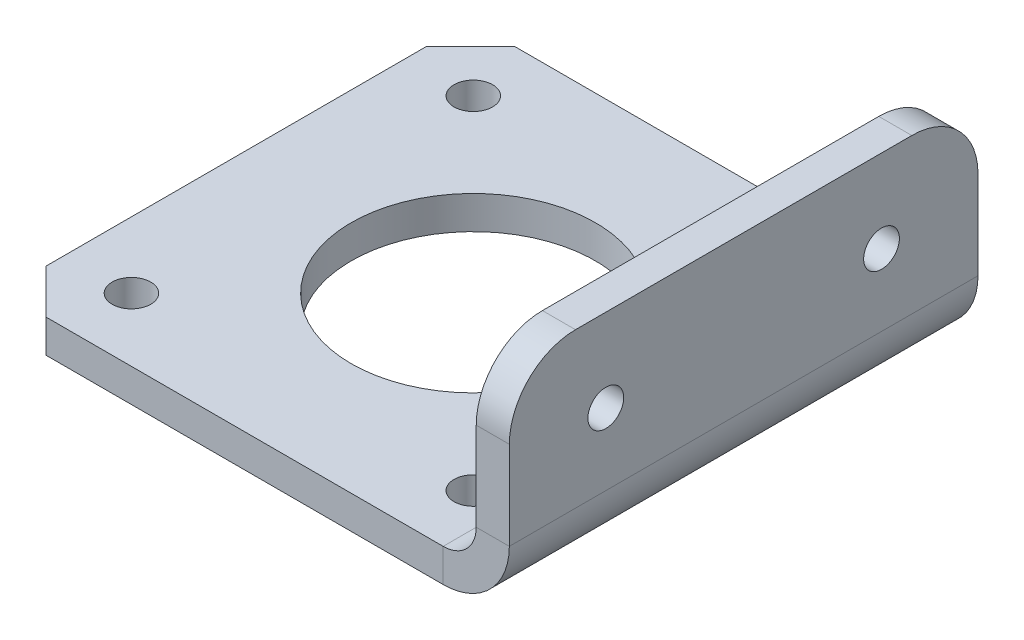
ISO-10303-21;
HEADER;
FILE_DESCRIPTION(('STEP AP214'),'2;1');
FILE_NAME('part.step','',(''),(''),'','','');
FILE_SCHEMA(('AUTOMOTIVE_DESIGN { 1 0 10303 214 1 1 1 1 }'));
ENDSEC;
DATA;
#1=APPLICATION_CONTEXT('core data for automotive mechanical design processes');
#2=APPLICATION_PROTOCOL_DEFINITION('international standard','automotive_design',2000,#1);
#3=PRODUCT_CONTEXT('',#1,'mechanical');
#4=PRODUCT('Part','Part','',(#3));
#5=PRODUCT_RELATED_PRODUCT_CATEGORY('part','',(#4));
#6=PRODUCT_DEFINITION_FORMATION('','',#4);
#7=PRODUCT_DEFINITION_CONTEXT('part definition',#1,'design');
#8=PRODUCT_DEFINITION('design','',#6,#7);
#9=PRODUCT_DEFINITION_SHAPE('','',#8);
#10=(LENGTH_UNIT() NAMED_UNIT(*) SI_UNIT(.MILLI.,.METRE.));
#11=(NAMED_UNIT(*) PLANE_ANGLE_UNIT() SI_UNIT($,.RADIAN.));
#12=(NAMED_UNIT(*) SI_UNIT($,.STERADIAN.) SOLID_ANGLE_UNIT());
#13=UNCERTAINTY_MEASURE_WITH_UNIT(LENGTH_MEASURE(1.E-05),#10,'distance_accuracy_value','');
#14=(GEOMETRIC_REPRESENTATION_CONTEXT(3) GLOBAL_UNCERTAINTY_ASSIGNED_CONTEXT((#13)) GLOBAL_UNIT_ASSIGNED_CONTEXT((#10,
#11,#12)) REPRESENTATION_CONTEXT('',''));
#15=CARTESIAN_POINT('',(0.,0.,0.));
#16=DIRECTION('',(0.,0.,1.));
#17=DIRECTION('',(1.,0.,0.));
#18=AXIS2_PLACEMENT_3D('',#15,#16,#17);
#19=CARTESIAN_POINT('',(1.51570826471148,11.0157082647115,-21.25));
#20=DIRECTION('',(0.,0.,-1.));
#21=DIRECTION('',(0.,-1.,0.));
#22=AXIS2_PLACEMENT_3D('',#19,#20,#21);
#23=PLANE('',#22);
#24=DIRECTION('',(0.,-1.,0.));
#25=VECTOR('',#24,1.);
#26=CARTESIAN_POINT('',(1.51570826471148,11.0157082647115,-21.25));
#27=LINE('',#26,#25);
#28=CARTESIAN_POINT('',(1.51570826471148,11.0157082647115,-21.25));
#29=VERTEX_POINT('',#28);
#30=CARTESIAN_POINT('',(1.51570826471148,3.,-21.25));
#31=VERTEX_POINT('',#30);
#32=EDGE_CURVE('E165',#29,#31,#27,.T.);
#33=ORIENTED_EDGE('',*,*,#32,.T.);
#34=DIRECTION('',(-1.,0.,0.));
#35=VECTOR('',#34,1.);
#36=CARTESIAN_POINT('',(1.51570826471148,3.,-21.25));
#37=LINE('',#36,#35);
#38=CARTESIAN_POINT('',(-1.48429173528852,3.,-21.25));
#39=VERTEX_POINT('',#38);
#40=EDGE_CURVE('E149',#31,#39,#37,.T.);
#41=ORIENTED_EDGE('',*,*,#40,.T.);
#42=DIRECTION('',(0.,-1.,0.));
#43=VECTOR('',#42,1.);
#44=CARTESIAN_POINT('',(-1.48429173528852,11.0157082647115,-21.25));
#45=LINE('',#44,#43);
#46=CARTESIAN_POINT('',(-1.48429173528852,11.0157082647115,-21.25));
#47=VERTEX_POINT('',#46);
#48=EDGE_CURVE('E46',#47,#39,#45,.T.);
#49=ORIENTED_EDGE('',*,*,#48,.F.);
#50=DIRECTION('',(-1.,0.,0.));
#51=VECTOR('',#50,1.);
#52=CARTESIAN_POINT('',(1.51570826471148,11.0157082647115,-21.25));
#53=LINE('',#52,#51);
#54=EDGE_CURVE('E68',#29,#47,#53,.T.);
#55=ORIENTED_EDGE('',*,*,#54,.F.);
#56=EDGE_LOOP('',(#33,#41,#49,#55));
#57=FACE_BOUND('',#56,.T.);
#58=ADVANCED_FACE('F42',(#57),#23,.T.);
#59=CARTESIAN_POINT('',(1.51570826471148,-40.0842917352885,21.25));
#60=DIRECTION('',(0.,0.,1.));
#61=DIRECTION('',(0.,1.,0.));
#62=AXIS2_PLACEMENT_3D('',#59,#60,#61);
#63=PLANE('',#62);
#64=DIRECTION('',(0.,1.,0.));
#65=VECTOR('',#64,1.);
#66=CARTESIAN_POINT('',(-1.48429173528852,-40.0842917352885,21.25));
#67=LINE('',#66,#65);
#68=CARTESIAN_POINT('',(-1.48429173528851,3.,21.25));
#69=VERTEX_POINT('',#68);
#70=CARTESIAN_POINT('',(-1.48429173528851,11.0157082647115,21.25));
#71=VERTEX_POINT('',#70);
#72=EDGE_CURVE('E176',#69,#71,#67,.T.);
#73=ORIENTED_EDGE('',*,*,#72,.F.);
#74=DIRECTION('',(1.,0.,0.));
#75=VECTOR('',#74,1.);
#76=CARTESIAN_POINT('',(1.51570826471149,3.,21.25));
#77=LINE('',#76,#75);
#78=CARTESIAN_POINT('',(1.51570826471148,3.,21.25));
#79=VERTEX_POINT('',#78);
#80=EDGE_CURVE('E12',#69,#79,#77,.T.);
#81=ORIENTED_EDGE('',*,*,#80,.T.);
#82=DIRECTION('',(0.,1.,0.));
#83=VECTOR('',#82,1.);
#84=CARTESIAN_POINT('',(1.51570826471148,-40.0842917352885,21.25));
#85=LINE('',#84,#83);
#86=CARTESIAN_POINT('',(1.51570826471149,11.0157082647115,21.25));
#87=VERTEX_POINT('',#86);
#88=EDGE_CURVE('E94',#79,#87,#85,.T.);
#89=ORIENTED_EDGE('',*,*,#88,.T.);
#90=DIRECTION('',(-1.,0.,0.));
#91=VECTOR('',#90,1.);
#92=CARTESIAN_POINT('',(1.51570826471149,11.0157082647115,21.25));
#93=LINE('',#92,#91);
#94=EDGE_CURVE('E174',#87,#71,#93,.T.);
#95=ORIENTED_EDGE('',*,*,#94,.T.);
#96=EDGE_LOOP('',(#73,#81,#89,#95));
#97=FACE_BOUND('',#96,.T.);
#98=ADVANCED_FACE('F44',(#97),#63,.T.);
#99=CARTESIAN_POINT('',(-1.48429173528851,11.0157082647115,15.25));
#100=DIRECTION('',(-1.,0.,0.));
#101=DIRECTION('',(0.,0.,1.));
#102=AXIS2_PLACEMENT_3D('',#99,#100,#101);
#103=PLANE('',#102);
#104=CARTESIAN_POINT('',(-1.48429173528852,9.49979283786554,-12.5));
#105=DIRECTION('',(1.,0.,0.));
#106=DIRECTION('',(0.,0.,-1.));
#107=AXIS2_PLACEMENT_3D('',#104,#105,#106);
#108=CIRCLE('',#107,1.62099999999999);
#109=CARTESIAN_POINT('',(-1.48429173528852,9.49979283786554,-14.121));
#110=VERTEX_POINT('',#109);
#111=EDGE_CURVE('E178',#110,#110,#108,.T.);
#112=ORIENTED_EDGE('',*,*,#111,.T.);
#113=EDGE_LOOP('',(#112));
#114=FACE_BOUND('',#113,.T.);
#115=CARTESIAN_POINT('',(-1.48429173528852,9.49979283786554,12.5));
#116=DIRECTION('',(1.,0.,0.));
#117=DIRECTION('',(0.,0.,-1.));
#118=AXIS2_PLACEMENT_3D('',#115,#116,#117);
#119=CIRCLE('',#118,1.62099999999999);
#120=CARTESIAN_POINT('',(-1.48429173528852,9.49979283786554,10.879));
#121=VERTEX_POINT('',#120);
#122=EDGE_CURVE('E188',#121,#121,#119,.T.);
#123=ORIENTED_EDGE('',*,*,#122,.T.);
#124=EDGE_LOOP('',(#123));
#125=FACE_BOUND('',#124,.T.);
#126=ORIENTED_EDGE('',*,*,#48,.T.);
#127=DIRECTION('',(0.,0.,1.));
#128=VECTOR('',#127,1.);
#129=CARTESIAN_POINT('',(-1.48429173528851,3.,15.25));
#130=LINE('',#129,#128);
#131=EDGE_CURVE('E142',#39,#69,#130,.T.);
#132=ORIENTED_EDGE('',*,*,#131,.T.);
#133=ORIENTED_EDGE('',*,*,#72,.T.);
#134=CARTESIAN_POINT('',(-1.48429173528851,11.0157082647115,15.25));
#135=DIRECTION('',(-1.,0.,0.));
#136=DIRECTION('',(0.,0.,1.));
#137=AXIS2_PLACEMENT_3D('',#134,#135,#136);
#138=CIRCLE('',#137,6.);
#139=CARTESIAN_POINT('',(-1.48429173528851,17.0157082647115,15.25));
#140=VERTEX_POINT('',#139);
#141=EDGE_CURVE('E177',#71,#140,#138,.T.);
#142=ORIENTED_EDGE('',*,*,#141,.T.);
#143=DIRECTION('',(0.,0.,-1.));
#144=VECTOR('',#143,1.);
#145=CARTESIAN_POINT('',(-1.48429173528851,17.0157082647115,15.25));
#146=LINE('',#145,#144);
#147=CARTESIAN_POINT('',(-1.48429173528852,17.0157082647115,-15.25));
#148=VERTEX_POINT('',#147);
#149=EDGE_CURVE('E180',#140,#148,#146,.T.);
#150=ORIENTED_EDGE('',*,*,#149,.T.);
#151=CARTESIAN_POINT('',(-1.48429173528852,11.0157082647115,-15.25));
#152=DIRECTION('',(-1.,0.,0.));
#153=DIRECTION('',(0.,0.,1.));
#154=AXIS2_PLACEMENT_3D('',#151,#152,#153);
#155=CIRCLE('',#154,6.);
#156=EDGE_CURVE('E164',#148,#47,#155,.T.);
#157=ORIENTED_EDGE('',*,*,#156,.T.);
#158=EDGE_LOOP('',(#126,#132,#133,#142,#150,#157));
#159=FACE_BOUND('',#158,.T.);
#160=ADVANCED_FACE('F162',(#114,#125,#159),#103,.T.);
#161=CARTESIAN_POINT('',(1.51570826471148,11.0157082647115,-15.25));
#162=DIRECTION('',(-1.,0.,0.));
#163=DIRECTION('',(0.,0.,1.));
#164=AXIS2_PLACEMENT_3D('',#161,#162,#163);
#165=CYLINDRICAL_SURFACE('',#164,6.);
#166=ORIENTED_EDGE('',*,*,#156,.F.);
#167=DIRECTION('',(-1.,0.,0.));
#168=VECTOR('',#167,1.);
#169=CARTESIAN_POINT('',(1.51570826471148,17.0157082647115,-15.25));
#170=LINE('',#169,#168);
#171=CARTESIAN_POINT('',(1.51570826471148,17.0157082647115,-15.25));
#172=VERTEX_POINT('',#171);
#173=EDGE_CURVE('E202',#172,#148,#170,.T.);
#174=ORIENTED_EDGE('',*,*,#173,.F.);
#175=CARTESIAN_POINT('',(1.51570826471148,11.0157082647115,-15.25));
#176=DIRECTION('',(-1.,0.,0.));
#177=DIRECTION('',(0.,0.,1.));
#178=AXIS2_PLACEMENT_3D('',#175,#176,#177);
#179=CIRCLE('',#178,6.);
#180=EDGE_CURVE('E175',#172,#29,#179,.T.);
#181=ORIENTED_EDGE('',*,*,#180,.T.);
#182=ORIENTED_EDGE('',*,*,#54,.T.);
#183=EDGE_LOOP('',(#166,#174,#181,#182));
#184=FACE_BOUND('',#183,.T.);
#185=ADVANCED_FACE('F214',(#184),#165,.T.);
#186=CARTESIAN_POINT('',(1.51570826471149,17.0157082647115,15.25));
#187=DIRECTION('',(0.,1.,0.));
#188=DIRECTION('',(0.,0.,-1.));
#189=AXIS2_PLACEMENT_3D('',#186,#187,#188);
#190=PLANE('',#189);
#191=ORIENTED_EDGE('',*,*,#149,.F.);
#192=DIRECTION('',(-1.,0.,0.));
#193=VECTOR('',#192,1.);
#194=CARTESIAN_POINT('',(1.51570826471149,17.0157082647115,15.25));
#195=LINE('',#194,#193);
#196=CARTESIAN_POINT('',(1.51570826471149,17.0157082647115,15.25));
#197=VERTEX_POINT('',#196);
#198=EDGE_CURVE('E204',#197,#140,#195,.T.);
#199=ORIENTED_EDGE('',*,*,#198,.F.);
#200=DIRECTION('',(0.,0.,-1.));
#201=VECTOR('',#200,1.);
#202=CARTESIAN_POINT('',(1.51570826471149,17.0157082647115,15.25));
#203=LINE('',#202,#201);
#204=EDGE_CURVE('E194',#197,#172,#203,.T.);
#205=ORIENTED_EDGE('',*,*,#204,.T.);
#206=ORIENTED_EDGE('',*,*,#173,.T.);
#207=EDGE_LOOP('',(#191,#199,#205,#206));
#208=FACE_BOUND('',#207,.T.);
#209=ADVANCED_FACE('F211',(#208),#190,.T.);
#210=CARTESIAN_POINT('',(1.51570826471148,11.0157082647115,15.25));
#211=DIRECTION('',(-1.,0.,0.));
#212=DIRECTION('',(0.,0.,1.));
#213=AXIS2_PLACEMENT_3D('',#210,#211,#212);
#214=CYLINDRICAL_SURFACE('',#213,6.);
#215=ORIENTED_EDGE('',*,*,#141,.F.);
#216=ORIENTED_EDGE('',*,*,#94,.F.);
#217=CARTESIAN_POINT('',(1.51570826471148,11.0157082647115,15.25));
#218=DIRECTION('',(-1.,0.,0.));
#219=DIRECTION('',(0.,0.,1.));
#220=AXIS2_PLACEMENT_3D('',#217,#218,#219);
#221=CIRCLE('',#220,6.);
#222=EDGE_CURVE('E173',#87,#197,#221,.T.);
#223=ORIENTED_EDGE('',*,*,#222,.T.);
#224=ORIENTED_EDGE('',*,*,#198,.T.);
#225=EDGE_LOOP('',(#215,#216,#223,#224));
#226=FACE_BOUND('',#225,.T.);
#227=ADVANCED_FACE('F208',(#226),#214,.T.);
#228=CARTESIAN_POINT('',(1.51570826471148,11.0157082647115,15.25));
#229=DIRECTION('',(-1.,0.,0.));
#230=DIRECTION('',(0.,0.,1.));
#231=AXIS2_PLACEMENT_3D('',#228,#229,#230);
#232=PLANE('',#231);
#233=DIRECTION('',(0.,0.,1.));
#234=VECTOR('',#233,1.);
#235=CARTESIAN_POINT('',(1.51570826471148,3.,15.25));
#236=LINE('',#235,#234);
#237=EDGE_CURVE('E51',#31,#79,#236,.T.);
#238=ORIENTED_EDGE('',*,*,#237,.F.);
#239=ORIENTED_EDGE('',*,*,#32,.F.);
#240=ORIENTED_EDGE('',*,*,#180,.F.);
#241=ORIENTED_EDGE('',*,*,#204,.F.);
#242=ORIENTED_EDGE('',*,*,#222,.F.);
#243=ORIENTED_EDGE('',*,*,#88,.F.);
#244=EDGE_LOOP('',(#238,#239,#240,#241,#242,#243));
#245=FACE_BOUND('',#244,.T.);
#246=CARTESIAN_POINT('',(1.51570826471149,9.49979283786554,12.5));
#247=DIRECTION('',(1.,0.,0.));
#248=DIRECTION('',(0.,0.,-1.));
#249=AXIS2_PLACEMENT_3D('',#246,#247,#248);
#250=CIRCLE('',#249,1.62099999999999);
#251=CARTESIAN_POINT('',(1.51570826471149,9.49979283786554,10.879));
#252=VERTEX_POINT('',#251);
#253=EDGE_CURVE('E244',#252,#252,#250,.T.);
#254=ORIENTED_EDGE('',*,*,#253,.F.);
#255=EDGE_LOOP('',(#254));
#256=FACE_BOUND('',#255,.T.);
#257=CARTESIAN_POINT('',(1.51570826471148,9.49979283786554,-12.5));
#258=DIRECTION('',(1.,0.,0.));
#259=DIRECTION('',(0.,0.,-1.));
#260=AXIS2_PLACEMENT_3D('',#257,#258,#259);
#261=CIRCLE('',#260,1.62099999999999);
#262=CARTESIAN_POINT('',(1.51570826471148,9.49979283786554,-14.121));
#263=VERTEX_POINT('',#262);
#264=EDGE_CURVE('E183',#263,#263,#261,.T.);
#265=ORIENTED_EDGE('',*,*,#264,.F.);
#266=EDGE_LOOP('',(#265));
#267=FACE_BOUND('',#266,.T.);
#268=ADVANCED_FACE('F230',(#245,#256,#267),#232,.F.);
#269=CARTESIAN_POINT('',(1.51570826471148,9.49979283786554,-12.5));
#270=DIRECTION('',(1.,0.,0.));
#271=DIRECTION('',(0.,0.,-1.));
#272=AXIS2_PLACEMENT_3D('',#269,#270,#271);
#273=CYLINDRICAL_SURFACE('',#272,1.62099999999999);
#274=ORIENTED_EDGE('',*,*,#111,.F.);
#275=EDGE_LOOP('',(#274));
#276=FACE_BOUND('',#275,.T.);
#277=ORIENTED_EDGE('',*,*,#264,.T.);
#278=EDGE_LOOP('',(#277));
#279=FACE_BOUND('',#278,.T.);
#280=ADVANCED_FACE('F232',(#276,#279),#273,.F.);
#281=CARTESIAN_POINT('',(1.51570826471148,9.49979283786554,12.5));
#282=DIRECTION('',(1.,0.,0.));
#283=DIRECTION('',(0.,0.,-1.));
#284=AXIS2_PLACEMENT_3D('',#281,#282,#283);
#285=CYLINDRICAL_SURFACE('',#284,1.62099999999999);
#286=ORIENTED_EDGE('',*,*,#122,.F.);
#287=EDGE_LOOP('',(#286));
#288=FACE_BOUND('',#287,.T.);
#289=ORIENTED_EDGE('',*,*,#253,.T.);
#290=EDGE_LOOP('',(#289));
#291=FACE_BOUND('',#290,.T.);
#292=ADVANCED_FACE('F238',(#288,#291),#285,.F.);
#293=CARTESIAN_POINT('',(-7.5,0.,-15.5));
#294=DIRECTION('',(0.,1.,0.));
#295=DIRECTION('',(0.,0.,1.));
#296=AXIS2_PLACEMENT_3D('',#293,#294,#295);
#297=CYLINDRICAL_SURFACE('',#296,1.74999999999999);
#298=CARTESIAN_POINT('',(-7.5,-3.,-15.5));
#299=DIRECTION('',(0.,1.,0.));
#300=DIRECTION('',(0.,0.,1.));
#301=AXIS2_PLACEMENT_3D('',#298,#299,#300);
#302=CIRCLE('',#301,1.74999999999999);
#303=CARTESIAN_POINT('',(-7.5,-3.,-13.75));
#304=VERTEX_POINT('',#303);
#305=EDGE_CURVE('E311',#304,#304,#302,.T.);
#306=ORIENTED_EDGE('',*,*,#305,.F.);
#307=EDGE_LOOP('',(#306));
#308=FACE_BOUND('',#307,.T.);
#309=CARTESIAN_POINT('',(-7.5,0.,-15.5));
#310=DIRECTION('',(0.,1.,0.));
#311=DIRECTION('',(0.,0.,1.));
#312=AXIS2_PLACEMENT_3D('',#309,#310,#311);
#313=CIRCLE('',#312,1.74999999999999);
#314=CARTESIAN_POINT('',(-7.5,0.,-13.75));
#315=VERTEX_POINT('',#314);
#316=EDGE_CURVE('E260',#315,#315,#313,.T.);
#317=ORIENTED_EDGE('',*,*,#316,.T.);
#318=EDGE_LOOP('',(#317));
#319=FACE_BOUND('',#318,.T.);
#320=ADVANCED_FACE('F375',(#308,#319),#297,.F.);
#321=CARTESIAN_POINT('',(-38.5,0.,-15.5));
#322=DIRECTION('',(0.,1.,0.));
#323=DIRECTION('',(0.,0.,1.));
#324=AXIS2_PLACEMENT_3D('',#321,#322,#323);
#325=CYLINDRICAL_SURFACE('',#324,1.74999999999999);
#326=CARTESIAN_POINT('',(-38.5,-3.,-15.5));
#327=DIRECTION('',(0.,1.,0.));
#328=DIRECTION('',(0.,0.,1.));
#329=AXIS2_PLACEMENT_3D('',#326,#327,#328);
#330=CIRCLE('',#329,1.74999999999999);
#331=CARTESIAN_POINT('',(-38.5,-3.,-13.75));
#332=VERTEX_POINT('',#331);
#333=EDGE_CURVE('E314',#332,#332,#330,.T.);
#334=ORIENTED_EDGE('',*,*,#333,.F.);
#335=EDGE_LOOP('',(#334));
#336=FACE_BOUND('',#335,.T.);
#337=CARTESIAN_POINT('',(-38.5,0.,-15.5));
#338=DIRECTION('',(0.,1.,0.));
#339=DIRECTION('',(0.,0.,1.));
#340=AXIS2_PLACEMENT_3D('',#337,#338,#339);
#341=CIRCLE('',#340,1.74999999999999);
#342=CARTESIAN_POINT('',(-38.5,0.,-13.75));
#343=VERTEX_POINT('',#342);
#344=EDGE_CURVE('E263',#343,#343,#341,.T.);
#345=ORIENTED_EDGE('',*,*,#344,.T.);
#346=EDGE_LOOP('',(#345));
#347=FACE_BOUND('',#346,.T.);
#348=ADVANCED_FACE('F380',(#336,#347),#325,.F.);
#349=CARTESIAN_POINT('',(-38.5,0.,15.5));
#350=DIRECTION('',(0.,1.,0.));
#351=DIRECTION('',(0.,0.,1.));
#352=AXIS2_PLACEMENT_3D('',#349,#350,#351);
#353=CYLINDRICAL_SURFACE('',#352,1.74999999999999);
#354=CARTESIAN_POINT('',(-38.5,-3.,15.5));
#355=DIRECTION('',(0.,1.,0.));
#356=DIRECTION('',(0.,0.,1.));
#357=AXIS2_PLACEMENT_3D('',#354,#355,#356);
#358=CIRCLE('',#357,1.74999999999999);
#359=CARTESIAN_POINT('',(-38.5,-3.,17.25));
#360=VERTEX_POINT('',#359);
#361=EDGE_CURVE('E317',#360,#360,#358,.T.);
#362=ORIENTED_EDGE('',*,*,#361,.F.);
#363=EDGE_LOOP('',(#362));
#364=FACE_BOUND('',#363,.T.);
#365=CARTESIAN_POINT('',(-38.5,0.,15.5));
#366=DIRECTION('',(0.,1.,0.));
#367=DIRECTION('',(0.,0.,1.));
#368=AXIS2_PLACEMENT_3D('',#365,#366,#367);
#369=CIRCLE('',#368,1.74999999999999);
#370=CARTESIAN_POINT('',(-38.5,0.,17.25));
#371=VERTEX_POINT('',#370);
#372=EDGE_CURVE('E266',#371,#371,#369,.T.);
#373=ORIENTED_EDGE('',*,*,#372,.T.);
#374=EDGE_LOOP('',(#373));
#375=FACE_BOUND('',#374,.T.);
#376=ADVANCED_FACE('F388',(#364,#375),#353,.F.);
#377=CARTESIAN_POINT('',(-7.5,0.,15.5));
#378=DIRECTION('',(0.,1.,0.));
#379=DIRECTION('',(0.,0.,1.));
#380=AXIS2_PLACEMENT_3D('',#377,#378,#379);
#381=CYLINDRICAL_SURFACE('',#380,1.74999999999999);
#382=CARTESIAN_POINT('',(-7.5,-3.,15.5));
#383=DIRECTION('',(0.,1.,0.));
#384=DIRECTION('',(0.,0.,1.));
#385=AXIS2_PLACEMENT_3D('',#382,#383,#384);
#386=CIRCLE('',#385,1.74999999999999);
#387=CARTESIAN_POINT('',(-7.5,-3.,17.25));
#388=VERTEX_POINT('',#387);
#389=EDGE_CURVE('E320',#388,#388,#386,.T.);
#390=ORIENTED_EDGE('',*,*,#389,.F.);
#391=EDGE_LOOP('',(#390));
#392=FACE_BOUND('',#391,.T.);
#393=CARTESIAN_POINT('',(-7.5,0.,15.5));
#394=DIRECTION('',(0.,1.,0.));
#395=DIRECTION('',(0.,0.,1.));
#396=AXIS2_PLACEMENT_3D('',#393,#394,#395);
#397=CIRCLE('',#396,1.74999999999999);
#398=CARTESIAN_POINT('',(-7.5,0.,17.25));
#399=VERTEX_POINT('',#398);
#400=EDGE_CURVE('E269',#399,#399,#397,.T.);
#401=ORIENTED_EDGE('',*,*,#400,.T.);
#402=EDGE_LOOP('',(#401));
#403=FACE_BOUND('',#402,.T.);
#404=ADVANCED_FACE('F398',(#392,#403),#381,.F.);
#405=CARTESIAN_POINT('',(-23.,0.,0.));
#406=DIRECTION('',(0.,-1.,0.));
#407=DIRECTION('',(0.,0.,-1.));
#408=AXIS2_PLACEMENT_3D('',#405,#406,#407);
#409=CYLINDRICAL_SURFACE('',#408,11.075);
#410=CARTESIAN_POINT('',(-23.,0.,0.));
#411=DIRECTION('',(0.,-1.,0.));
#412=DIRECTION('',(0.,0.,1.));
#413=AXIS2_PLACEMENT_3D('',#410,#411,#412);
#414=CIRCLE('',#413,11.075);
#415=CARTESIAN_POINT('',(-23.,0.,11.075));
#416=VERTEX_POINT('',#415);
#417=EDGE_CURVE('E303',#416,#416,#414,.T.);
#418=ORIENTED_EDGE('',*,*,#417,.F.);
#419=EDGE_LOOP('',(#418));
#420=FACE_BOUND('',#419,.T.);
#421=CARTESIAN_POINT('',(-23.,-3.,0.));
#422=DIRECTION('',(0.,-1.,0.));
#423=DIRECTION('',(0.,0.,1.));
#424=AXIS2_PLACEMENT_3D('',#421,#422,#423);
#425=CIRCLE('',#424,11.075);
#426=CARTESIAN_POINT('',(-23.,-3.,11.075));
#427=VERTEX_POINT('',#426);
#428=EDGE_CURVE('E272',#427,#427,#425,.T.);
#429=ORIENTED_EDGE('',*,*,#428,.T.);
#430=EDGE_LOOP('',(#429));
#431=FACE_BOUND('',#430,.T.);
#432=ADVANCED_FACE('F402',(#420,#431),#409,.F.);
#433=CARTESIAN_POINT('',(-44.5,-3.,17.25));
#434=DIRECTION('',(-0.707106781186548,0.,0.707106781186547));
#435=DIRECTION('',(0.707106781186547,0.,0.707106781186548));
#436=AXIS2_PLACEMENT_3D('',#433,#434,#435);
#437=PLANE('',#436);
#438=DIRECTION('',(0.707106781186547,0.,0.707106781186548));
#439=VECTOR('',#438,1.);
#440=CARTESIAN_POINT('',(-44.5,0.,17.25));
#441=LINE('',#440,#439);
#442=CARTESIAN_POINT('',(-44.5,0.,17.25));
#443=VERTEX_POINT('',#442);
#444=CARTESIAN_POINT('',(-40.5,0.,21.25));
#445=VERTEX_POINT('',#444);
#446=EDGE_CURVE('E298',#443,#445,#441,.T.);
#447=ORIENTED_EDGE('',*,*,#446,.F.);
#448=DIRECTION('',(0.,1.,0.));
#449=VECTOR('',#448,1.);
#450=CARTESIAN_POINT('',(-44.5,-3.,17.25));
#451=LINE('',#450,#449);
#452=CARTESIAN_POINT('',(-44.5,-3.,17.25));
#453=VERTEX_POINT('',#452);
#454=EDGE_CURVE('E283',#453,#443,#451,.T.);
#455=ORIENTED_EDGE('',*,*,#454,.F.);
#456=DIRECTION('',(0.707106781186547,0.,0.707106781186548));
#457=VECTOR('',#456,1.);
#458=CARTESIAN_POINT('',(-44.5,-3.,17.25));
#459=LINE('',#458,#457);
#460=CARTESIAN_POINT('',(-40.5,-3.,21.25));
#461=VERTEX_POINT('',#460);
#462=EDGE_CURVE('E275',#453,#461,#459,.T.);
#463=ORIENTED_EDGE('',*,*,#462,.T.);
#464=DIRECTION('',(0.,1.,0.));
#465=VECTOR('',#464,1.);
#466=CARTESIAN_POINT('',(-40.5,-3.,21.25));
#467=LINE('',#466,#465);
#468=EDGE_CURVE('E278',#461,#445,#467,.T.);
#469=ORIENTED_EDGE('',*,*,#468,.T.);
#470=EDGE_LOOP('',(#447,#455,#463,#469));
#471=FACE_BOUND('',#470,.T.);
#472=ADVANCED_FACE('F351',(#471),#437,.T.);
#473=CARTESIAN_POINT('',(-44.5,-3.,-17.25));
#474=DIRECTION('',(-1.,0.,0.));
#475=DIRECTION('',(0.,0.,1.));
#476=AXIS2_PLACEMENT_3D('',#473,#474,#475);
#477=PLANE('',#476);
#478=DIRECTION('',(0.,0.,1.));
#479=VECTOR('',#478,1.);
#480=CARTESIAN_POINT('',(-44.5,0.,-17.25));
#481=LINE('',#480,#479);
#482=CARTESIAN_POINT('',(-44.5,0.,-17.25));
#483=VERTEX_POINT('',#482);
#484=EDGE_CURVE('E295',#483,#443,#481,.T.);
#485=ORIENTED_EDGE('',*,*,#484,.F.);
#486=DIRECTION('',(0.,1.,0.));
#487=VECTOR('',#486,1.);
#488=CARTESIAN_POINT('',(-44.5,-3.,-17.25));
#489=LINE('',#488,#487);
#490=CARTESIAN_POINT('',(-44.5,-3.,-17.25));
#491=VERTEX_POINT('',#490);
#492=EDGE_CURVE('E288',#491,#483,#489,.T.);
#493=ORIENTED_EDGE('',*,*,#492,.F.);
#494=DIRECTION('',(0.,0.,1.));
#495=VECTOR('',#494,1.);
#496=CARTESIAN_POINT('',(-44.5,-3.,-17.25));
#497=LINE('',#496,#495);
#498=EDGE_CURVE('E280',#491,#453,#497,.T.);
#499=ORIENTED_EDGE('',*,*,#498,.T.);
#500=ORIENTED_EDGE('',*,*,#454,.T.);
#501=EDGE_LOOP('',(#485,#493,#499,#500));
#502=FACE_BOUND('',#501,.T.);
#503=ADVANCED_FACE('F354',(#502),#477,.T.);
#504=CARTESIAN_POINT('',(-40.5,-3.,-21.25));
#505=DIRECTION('',(-0.707106781186548,0.,-0.707106781186547));
#506=DIRECTION('',(-0.707106781186547,0.,0.707106781186548));
#507=AXIS2_PLACEMENT_3D('',#504,#505,#506);
#508=PLANE('',#507);
#509=DIRECTION('',(-0.707106781186547,0.,0.707106781186548));
#510=VECTOR('',#509,1.);
#511=CARTESIAN_POINT('',(-40.5,0.,-21.25));
#512=LINE('',#511,#510);
#513=CARTESIAN_POINT('',(-40.5,0.,-21.25));
#514=VERTEX_POINT('',#513);
#515=EDGE_CURVE('E292',#514,#483,#512,.T.);
#516=ORIENTED_EDGE('',*,*,#515,.F.);
#517=DIRECTION('',(0.,1.,0.));
#518=VECTOR('',#517,1.);
#519=CARTESIAN_POINT('',(-40.5,-3.,-21.25));
#520=LINE('',#519,#518);
#521=CARTESIAN_POINT('',(-40.5,-3.,-21.25));
#522=VERTEX_POINT('',#521);
#523=EDGE_CURVE('E308',#522,#514,#520,.T.);
#524=ORIENTED_EDGE('',*,*,#523,.F.);
#525=DIRECTION('',(-0.707106781186547,0.,0.707106781186548));
#526=VECTOR('',#525,1.);
#527=CARTESIAN_POINT('',(-40.5,-3.,-21.25));
#528=LINE('',#527,#526);
#529=EDGE_CURVE('E285',#522,#491,#528,.T.);
#530=ORIENTED_EDGE('',*,*,#529,.T.);
#531=ORIENTED_EDGE('',*,*,#492,.T.);
#532=EDGE_LOOP('',(#516,#524,#530,#531));
#533=FACE_BOUND('',#532,.T.);
#534=ADVANCED_FACE('F358',(#533),#508,.T.);
#535=CARTESIAN_POINT('',(10.6,0.,15.25));
#536=DIRECTION('',(0.,1.,0.));
#537=DIRECTION('',(0.,0.,1.));
#538=AXIS2_PLACEMENT_3D('',#535,#536,#537);
#539=PLANE('',#538);
#540=DIRECTION('',(0.,0.,1.));
#541=VECTOR('',#540,1.);
#542=CARTESIAN_POINT('',(-4.48429173528852,0.,15.25));
#543=LINE('',#542,#541);
#544=CARTESIAN_POINT('',(-4.48429173528852,0.,-21.25));
#545=VERTEX_POINT('',#544);
#546=CARTESIAN_POINT('',(-4.48429173528852,0.,21.25));
#547=VERTEX_POINT('',#546);
#548=EDGE_CURVE('E254',#545,#547,#543,.T.);
#549=ORIENTED_EDGE('',*,*,#548,.F.);
#550=DIRECTION('',(-1.,0.,0.));
#551=VECTOR('',#550,1.);
#552=CARTESIAN_POINT('',(10.6,0.,-21.25));
#553=LINE('',#552,#551);
#554=EDGE_CURVE('E290',#545,#514,#553,.T.);
#555=ORIENTED_EDGE('',*,*,#554,.T.);
#556=ORIENTED_EDGE('',*,*,#515,.T.);
#557=ORIENTED_EDGE('',*,*,#484,.T.);
#558=ORIENTED_EDGE('',*,*,#446,.T.);
#559=DIRECTION('',(1.,0.,0.));
#560=VECTOR('',#559,1.);
#561=CARTESIAN_POINT('',(-40.5,0.,21.25));
#562=LINE('',#561,#560);
#563=EDGE_CURVE('E301',#445,#547,#562,.T.);
#564=ORIENTED_EDGE('',*,*,#563,.T.);
#565=EDGE_LOOP('',(#549,#555,#556,#557,#558,#564));
#566=FACE_BOUND('',#565,.T.);
#567=ORIENTED_EDGE('',*,*,#417,.T.);
#568=EDGE_LOOP('',(#567));
#569=FACE_BOUND('',#568,.T.);
#570=ORIENTED_EDGE('',*,*,#400,.F.);
#571=EDGE_LOOP('',(#570));
#572=FACE_BOUND('',#571,.T.);
#573=ORIENTED_EDGE('',*,*,#372,.F.);
#574=EDGE_LOOP('',(#573));
#575=FACE_BOUND('',#574,.T.);
#576=ORIENTED_EDGE('',*,*,#344,.F.);
#577=EDGE_LOOP('',(#576));
#578=FACE_BOUND('',#577,.T.);
#579=ORIENTED_EDGE('',*,*,#316,.F.);
#580=EDGE_LOOP('',(#579));
#581=FACE_BOUND('',#580,.T.);
#582=ADVANCED_FACE('F346',(#566,#569,#572,#575,#578,#581),#539,.T.);
#583=CARTESIAN_POINT('',(10.6,-3.,-21.25));
#584=DIRECTION('',(0.,0.,-1.));
#585=DIRECTION('',(-1.,0.,0.));
#586=AXIS2_PLACEMENT_3D('',#583,#584,#585);
#587=PLANE('',#586);
#588=DIRECTION('',(0.,1.,0.));
#589=VECTOR('',#588,1.);
#590=CARTESIAN_POINT('',(-4.48429173528852,-3.,-21.25));
#591=LINE('',#590,#589);
#592=CARTESIAN_POINT('',(-4.48429173528852,-3.,-21.25));
#593=VERTEX_POINT('',#592);
#594=EDGE_CURVE('E158',#593,#545,#591,.T.);
#595=ORIENTED_EDGE('',*,*,#594,.F.);
#596=DIRECTION('',(-1.,0.,0.));
#597=VECTOR('',#596,1.);
#598=CARTESIAN_POINT('',(10.6,-3.,-21.25));
#599=LINE('',#598,#597);
#600=EDGE_CURVE('E306',#593,#522,#599,.T.);
#601=ORIENTED_EDGE('',*,*,#600,.T.);
#602=ORIENTED_EDGE('',*,*,#523,.T.);
#603=ORIENTED_EDGE('',*,*,#554,.F.);
#604=EDGE_LOOP('',(#595,#601,#602,#603));
#605=FACE_BOUND('',#604,.T.);
#606=ADVANCED_FACE('F360',(#605),#587,.T.);
#607=CARTESIAN_POINT('',(10.6,-3.,15.25));
#608=DIRECTION('',(0.,1.,0.));
#609=DIRECTION('',(0.,0.,1.));
#610=AXIS2_PLACEMENT_3D('',#607,#608,#609);
#611=PLANE('',#610);
#612=ORIENTED_EDGE('',*,*,#305,.T.);
#613=EDGE_LOOP('',(#612));
#614=FACE_BOUND('',#613,.T.);
#615=ORIENTED_EDGE('',*,*,#333,.T.);
#616=EDGE_LOOP('',(#615));
#617=FACE_BOUND('',#616,.T.);
#618=ORIENTED_EDGE('',*,*,#361,.T.);
#619=EDGE_LOOP('',(#618));
#620=FACE_BOUND('',#619,.T.);
#621=ORIENTED_EDGE('',*,*,#389,.T.);
#622=EDGE_LOOP('',(#621));
#623=FACE_BOUND('',#622,.T.);
#624=ORIENTED_EDGE('',*,*,#428,.F.);
#625=EDGE_LOOP('',(#624));
#626=FACE_BOUND('',#625,.T.);
#627=ORIENTED_EDGE('',*,*,#600,.F.);
#628=DIRECTION('',(0.,0.,1.));
#629=VECTOR('',#628,1.);
#630=CARTESIAN_POINT('',(-4.48429173528852,-3.,15.25));
#631=LINE('',#630,#629);
#632=CARTESIAN_POINT('',(-4.48429173528852,-3.,21.25));
#633=VERTEX_POINT('',#632);
#634=EDGE_CURVE('E251',#593,#633,#631,.T.);
#635=ORIENTED_EDGE('',*,*,#634,.T.);
#636=DIRECTION('',(1.,0.,0.));
#637=VECTOR('',#636,1.);
#638=CARTESIAN_POINT('',(-40.5,-3.,21.25));
#639=LINE('',#638,#637);
#640=EDGE_CURVE('E248',#461,#633,#639,.T.);
#641=ORIENTED_EDGE('',*,*,#640,.F.);
#642=ORIENTED_EDGE('',*,*,#462,.F.);
#643=ORIENTED_EDGE('',*,*,#498,.F.);
#644=ORIENTED_EDGE('',*,*,#529,.F.);
#645=EDGE_LOOP('',(#627,#635,#641,#642,#643,#644));
#646=FACE_BOUND('',#645,.T.);
#647=ADVANCED_FACE('F335',(#614,#617,#620,#623,#626,#646),#611,.F.);
#648=CARTESIAN_POINT('',(-40.5,-3.,21.25));
#649=DIRECTION('',(0.,0.,1.));
#650=DIRECTION('',(1.,0.,0.));
#651=AXIS2_PLACEMENT_3D('',#648,#649,#650);
#652=PLANE('',#651);
#653=DIRECTION('',(0.,-1.,0.));
#654=VECTOR('',#653,1.);
#655=CARTESIAN_POINT('',(-4.48429173528851,-3.,21.25));
#656=LINE('',#655,#654);
#657=EDGE_CURVE('E256',#547,#633,#656,.T.);
#658=ORIENTED_EDGE('',*,*,#657,.F.);
#659=ORIENTED_EDGE('',*,*,#563,.F.);
#660=ORIENTED_EDGE('',*,*,#468,.F.);
#661=ORIENTED_EDGE('',*,*,#640,.T.);
#662=EDGE_LOOP('',(#658,#659,#660,#661));
#663=FACE_BOUND('',#662,.T.);
#664=ADVANCED_FACE('F343',(#663),#652,.T.);
#665=CARTESIAN_POINT('',(-4.48429173528852,3.,-21.25));
#666=DIRECTION('',(0.,0.,1.));
#667=DIRECTION('',(1.,0.,0.));
#668=AXIS2_PLACEMENT_3D('',#665,#666,#667);
#669=PLANE('',#668);
#670=ORIENTED_EDGE('',*,*,#40,.F.);
#671=CARTESIAN_POINT('',(-4.48429173528852,3.,-21.25));
#672=DIRECTION('',(0.,0.,-1.));
#673=DIRECTION('',(-1.,0.,0.));
#674=AXIS2_PLACEMENT_3D('',#671,#672,#673);
#675=CIRCLE('',#674,6.);
#676=EDGE_CURVE('E327',#31,#593,#675,.T.);
#677=ORIENTED_EDGE('',*,*,#676,.T.);
#678=ORIENTED_EDGE('',*,*,#594,.T.);
#679=CARTESIAN_POINT('',(-4.48429173528852,3.,-21.25));
#680=DIRECTION('',(0.,0.,-1.));
#681=DIRECTION('',(-1.,0.,0.));
#682=AXIS2_PLACEMENT_3D('',#679,#680,#681);
#683=CIRCLE('',#682,3.);
#684=EDGE_CURVE('E145',#39,#545,#683,.T.);
#685=ORIENTED_EDGE('',*,*,#684,.F.);
#686=EDGE_LOOP('',(#670,#677,#678,#685));
#687=FACE_BOUND('',#686,.T.);
#688=ADVANCED_FACE('F153',(#687),#669,.F.);
#689=CARTESIAN_POINT('',(-4.48429173528851,3.,21.25));
#690=DIRECTION('',(0.,0.,-1.));
#691=DIRECTION('',(-1.,0.,0.));
#692=AXIS2_PLACEMENT_3D('',#689,#690,#691);
#693=PLANE('',#692);
#694=CARTESIAN_POINT('',(-4.48429173528851,3.,21.25));
#695=DIRECTION('',(0.,0.,-1.));
#696=DIRECTION('',(-1.,0.,0.));
#697=AXIS2_PLACEMENT_3D('',#694,#695,#696);
#698=CIRCLE('',#697,6.);
#699=EDGE_CURVE('E159',#633,#79,#698,.F.);
#700=ORIENTED_EDGE('',*,*,#699,.T.);
#701=ORIENTED_EDGE('',*,*,#80,.F.);
#702=CARTESIAN_POINT('',(-4.48429173528851,3.,21.25));
#703=DIRECTION('',(0.,0.,1.));
#704=DIRECTION('',(1.,0.,0.));
#705=AXIS2_PLACEMENT_3D('',#702,#703,#704);
#706=CIRCLE('',#705,3.);
#707=EDGE_CURVE('E59',#547,#69,#706,.T.);
#708=ORIENTED_EDGE('',*,*,#707,.F.);
#709=ORIENTED_EDGE('',*,*,#657,.T.);
#710=EDGE_LOOP('',(#700,#701,#708,#709));
#711=FACE_BOUND('',#710,.T.);
#712=ADVANCED_FACE('F340',(#711),#693,.F.);
#713=CARTESIAN_POINT('',(-4.48429173528851,3.,43.1881334660404));
#714=DIRECTION('',(0.,0.,-1.));
#715=DIRECTION('',(-1.,0.,0.));
#716=AXIS2_PLACEMENT_3D('',#713,#714,#715);
#717=CYLINDRICAL_SURFACE('',#716,3.);
#718=ORIENTED_EDGE('',*,*,#548,.T.);
#719=ORIENTED_EDGE('',*,*,#707,.T.);
#720=ORIENTED_EDGE('',*,*,#131,.F.);
#721=ORIENTED_EDGE('',*,*,#684,.T.);
#722=EDGE_LOOP('',(#718,#719,#720,#721));
#723=FACE_BOUND('',#722,.T.);
#724=ADVANCED_FACE('F144',(#723),#717,.F.);
#725=CARTESIAN_POINT('',(-4.48429173528851,3.,43.1881334660404));
#726=DIRECTION('',(0.,0.,-1.));
#727=DIRECTION('',(-1.,0.,0.));
#728=AXIS2_PLACEMENT_3D('',#725,#726,#727);
#729=CYLINDRICAL_SURFACE('',#728,6.);
#730=ORIENTED_EDGE('',*,*,#634,.F.);
#731=ORIENTED_EDGE('',*,*,#676,.F.);
#732=ORIENTED_EDGE('',*,*,#237,.T.);
#733=ORIENTED_EDGE('',*,*,#699,.F.);
#734=EDGE_LOOP('',(#730,#731,#732,#733));
#735=FACE_BOUND('',#734,.T.);
#736=ADVANCED_FACE('F331',(#735),#729,.T.);
#737=CLOSED_SHELL('',(#58,#98,#160,#185,#209,#227,#268,#280,#292,#320,#348,#376,#404,#432,#472,
#503,#534,#582,#606,#647,#664,#688,#712,#724,#736));
#738=MANIFOLD_SOLID_BREP('B2',#737);
#739=ADVANCED_BREP_SHAPE_REPRESENTATION('',(#18,#738),#14);
#740=SHAPE_DEFINITION_REPRESENTATION(#9,#739);
ENDSEC;
END-ISO-10303-21;
